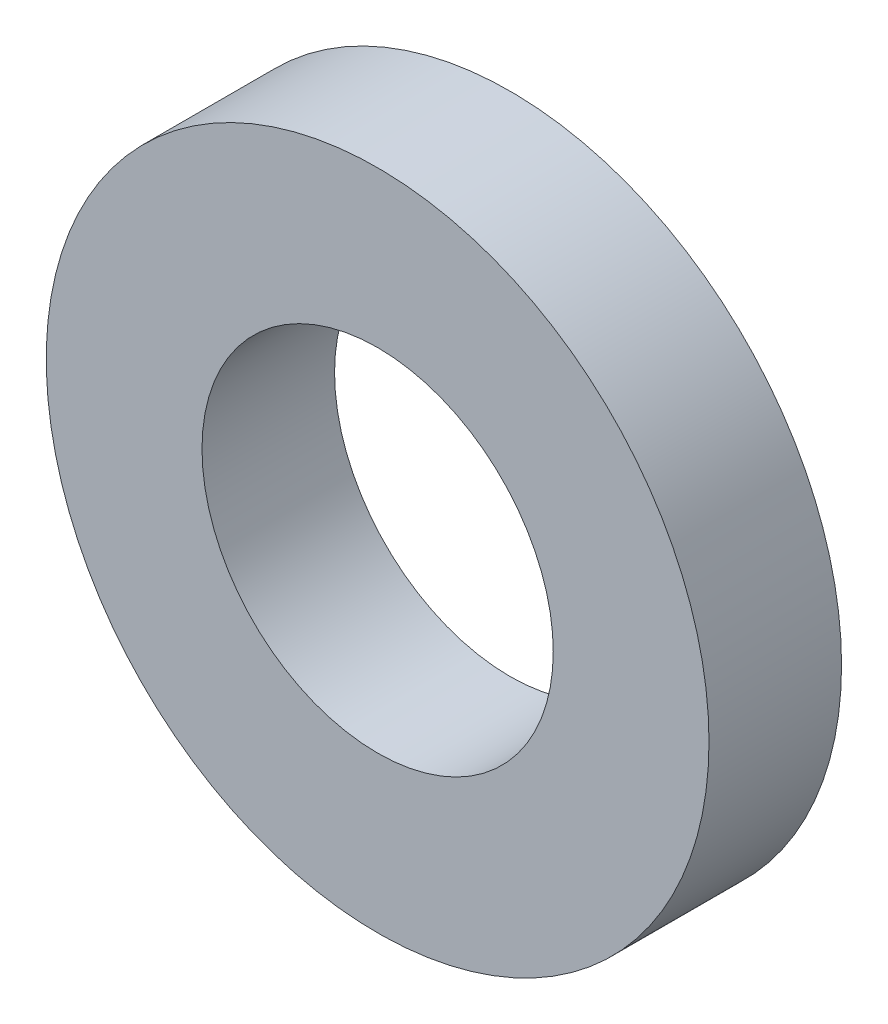
ISO-10303-21;
HEADER;
FILE_DESCRIPTION(('STEP AP214'),'2;1');
FILE_NAME('part.step','',(''),(''),'','','');
FILE_SCHEMA(('AUTOMOTIVE_DESIGN { 1 0 10303 214 1 1 1 1 }'));
ENDSEC;
DATA;
#1=APPLICATION_CONTEXT('core data for automotive mechanical design processes');
#2=APPLICATION_PROTOCOL_DEFINITION('international standard','automotive_design',2000,#1);
#3=PRODUCT_CONTEXT('',#1,'mechanical');
#4=PRODUCT('Part','Part','',(#3));
#5=PRODUCT_RELATED_PRODUCT_CATEGORY('part','',(#4));
#6=PRODUCT_DEFINITION_FORMATION('','',#4);
#7=PRODUCT_DEFINITION_CONTEXT('part definition',#1,'design');
#8=PRODUCT_DEFINITION('design','',#6,#7);
#9=PRODUCT_DEFINITION_SHAPE('','',#8);
#10=(LENGTH_UNIT() NAMED_UNIT(*) SI_UNIT(.MILLI.,.METRE.));
#11=(NAMED_UNIT(*) PLANE_ANGLE_UNIT() SI_UNIT($,.RADIAN.));
#12=(NAMED_UNIT(*) SI_UNIT($,.STERADIAN.) SOLID_ANGLE_UNIT());
#13=UNCERTAINTY_MEASURE_WITH_UNIT(LENGTH_MEASURE(1.E-05),#10,'distance_accuracy_value','');
#14=(GEOMETRIC_REPRESENTATION_CONTEXT(3) GLOBAL_UNCERTAINTY_ASSIGNED_CONTEXT((#13)) GLOBAL_UNIT_ASSIGNED_CONTEXT((#10,
#11,#12)) REPRESENTATION_CONTEXT('',''));
#15=CARTESIAN_POINT('',(0.,0.,0.));
#16=DIRECTION('',(0.,0.,1.));
#17=DIRECTION('',(1.,0.,0.));
#18=AXIS2_PLACEMENT_3D('',#15,#16,#17);
#19=CARTESIAN_POINT('',(0.,0.,2.));
#20=DIRECTION('',(0.,0.,1.));
#21=DIRECTION('',(1.,0.,0.));
#22=AXIS2_PLACEMENT_3D('',#19,#20,#21);
#23=PLANE('',#22);
#24=CARTESIAN_POINT('',(0.,0.,2.));
#25=DIRECTION('',(0.,0.,1.));
#26=DIRECTION('',(1.,0.,0.));
#27=AXIS2_PLACEMENT_3D('',#24,#25,#26);
#28=CIRCLE('',#27,5.);
#29=CARTESIAN_POINT('',(5.,0.,2.));
#30=VERTEX_POINT('',#29);
#31=EDGE_CURVE('E10',#30,#30,#28,.T.);
#32=ORIENTED_EDGE('',*,*,#31,.T.);
#33=EDGE_LOOP('',(#32));
#34=FACE_BOUND('',#33,.T.);
#35=CARTESIAN_POINT('',(0.,0.,2.));
#36=DIRECTION('',(0.,0.,1.));
#37=DIRECTION('',(1.,0.,0.));
#38=AXIS2_PLACEMENT_3D('',#35,#36,#37);
#39=CIRCLE('',#38,2.65);
#40=CARTESIAN_POINT('',(2.65,0.,2.));
#41=VERTEX_POINT('',#40);
#42=EDGE_CURVE('E45',#41,#41,#39,.T.);
#43=ORIENTED_EDGE('',*,*,#42,.F.);
#44=EDGE_LOOP('',(#43));
#45=FACE_BOUND('',#44,.T.);
#46=ADVANCED_FACE('F34',(#34,#45),#23,.T.);
#47=CARTESIAN_POINT('',(0.,0.,0.));
#48=DIRECTION('',(0.,0.,1.));
#49=DIRECTION('',(1.,0.,0.));
#50=AXIS2_PLACEMENT_3D('',#47,#48,#49);
#51=PLANE('',#50);
#52=CARTESIAN_POINT('',(0.,0.,0.));
#53=DIRECTION('',(0.,0.,1.));
#54=DIRECTION('',(1.,0.,0.));
#55=AXIS2_PLACEMENT_3D('',#52,#53,#54);
#56=CIRCLE('',#55,5.);
#57=CARTESIAN_POINT('',(5.,0.,0.));
#58=VERTEX_POINT('',#57);
#59=EDGE_CURVE('E38',#58,#58,#56,.T.);
#60=ORIENTED_EDGE('',*,*,#59,.F.);
#61=EDGE_LOOP('',(#60));
#62=FACE_BOUND('',#61,.T.);
#63=CARTESIAN_POINT('',(0.,0.,0.));
#64=DIRECTION('',(0.,0.,1.));
#65=DIRECTION('',(1.,0.,0.));
#66=AXIS2_PLACEMENT_3D('',#63,#64,#65);
#67=CIRCLE('',#66,2.65);
#68=CARTESIAN_POINT('',(2.65,0.,0.));
#69=VERTEX_POINT('',#68);
#70=EDGE_CURVE('E47',#69,#69,#67,.T.);
#71=ORIENTED_EDGE('',*,*,#70,.T.);
#72=EDGE_LOOP('',(#71));
#73=FACE_BOUND('',#72,.T.);
#74=ADVANCED_FACE('F57',(#62,#73),#51,.F.);
#75=CARTESIAN_POINT('',(0.,0.,2.));
#76=DIRECTION('',(0.,0.,-1.));
#77=DIRECTION('',(-1.,0.,0.));
#78=AXIS2_PLACEMENT_3D('',#75,#76,#77);
#79=CYLINDRICAL_SURFACE('',#78,5.);
#80=ORIENTED_EDGE('',*,*,#31,.F.);
#81=EDGE_LOOP('',(#80));
#82=FACE_BOUND('',#81,.T.);
#83=ORIENTED_EDGE('',*,*,#59,.T.);
#84=EDGE_LOOP('',(#83));
#85=FACE_BOUND('',#84,.T.);
#86=ADVANCED_FACE('F36',(#82,#85),#79,.T.);
#87=CARTESIAN_POINT('',(0.,0.,2.));
#88=DIRECTION('',(0.,0.,-1.));
#89=DIRECTION('',(-1.,0.,0.));
#90=AXIS2_PLACEMENT_3D('',#87,#88,#89);
#91=CYLINDRICAL_SURFACE('',#90,2.65);
#92=ORIENTED_EDGE('',*,*,#42,.T.);
#93=EDGE_LOOP('',(#92));
#94=FACE_BOUND('',#93,.T.);
#95=ORIENTED_EDGE('',*,*,#70,.F.);
#96=EDGE_LOOP('',(#95));
#97=FACE_BOUND('',#96,.T.);
#98=ADVANCED_FACE('F53',(#94,#97),#91,.F.);
#99=CLOSED_SHELL('',(#46,#74,#86,#98));
#100=MANIFOLD_SOLID_BREP('B2',#99);
#101=ADVANCED_BREP_SHAPE_REPRESENTATION('',(#18,#100),#14);
#102=SHAPE_DEFINITION_REPRESENTATION(#9,#101);
ENDSEC;
END-ISO-10303-21;
